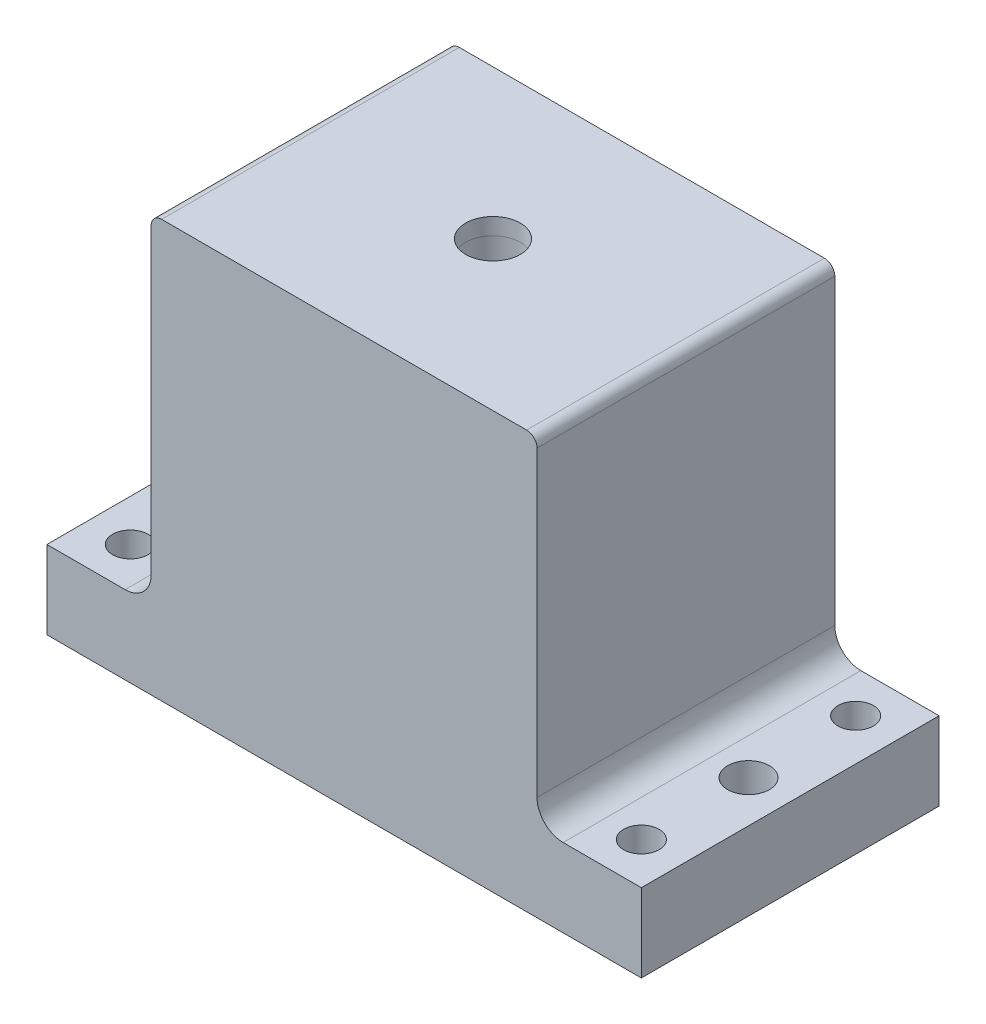
ISO-10303-21;
HEADER;
FILE_DESCRIPTION(('STEP AP214'),'2;1');
FILE_NAME('part.step','',(''),(''),'','','');
FILE_SCHEMA(('AUTOMOTIVE_DESIGN { 1 0 10303 214 1 1 1 1 }'));
ENDSEC;
DATA;
#1=APPLICATION_CONTEXT('core data for automotive mechanical design processes');
#2=APPLICATION_PROTOCOL_DEFINITION('international standard','automotive_design',2000,#1);
#3=PRODUCT_CONTEXT('',#1,'mechanical');
#4=PRODUCT('Part','Part','',(#3));
#5=PRODUCT_RELATED_PRODUCT_CATEGORY('part','',(#4));
#6=PRODUCT_DEFINITION_FORMATION('','',#4);
#7=PRODUCT_DEFINITION_CONTEXT('part definition',#1,'design');
#8=PRODUCT_DEFINITION('design','',#6,#7);
#9=PRODUCT_DEFINITION_SHAPE('','',#8);
#10=(LENGTH_UNIT() NAMED_UNIT(*) SI_UNIT(.MILLI.,.METRE.));
#11=(NAMED_UNIT(*) PLANE_ANGLE_UNIT() SI_UNIT($,.RADIAN.));
#12=(NAMED_UNIT(*) SI_UNIT($,.STERADIAN.) SOLID_ANGLE_UNIT());
#13=UNCERTAINTY_MEASURE_WITH_UNIT(LENGTH_MEASURE(1.E-05),#10,'distance_accuracy_value','');
#14=(GEOMETRIC_REPRESENTATION_CONTEXT(3) GLOBAL_UNCERTAINTY_ASSIGNED_CONTEXT((#13)) GLOBAL_UNIT_ASSIGNED_CONTEXT((#10,
#11,#12)) REPRESENTATION_CONTEXT('',''));
#15=CARTESIAN_POINT('',(0.,0.,0.));
#16=DIRECTION('',(0.,0.,1.));
#17=DIRECTION('',(1.,0.,0.));
#18=AXIS2_PLACEMENT_3D('',#15,#16,#17);
#19=CARTESIAN_POINT('',(37.,80.,28.55));
#20=DIRECTION('',(-1.,0.,0.));
#21=DIRECTION('',(0.,0.,1.));
#22=AXIS2_PLACEMENT_3D('',#19,#20,#21);
#23=PLANE('',#22);
#24=DIRECTION('',(0.,-1.,0.));
#25=VECTOR('',#24,1.);
#26=CARTESIAN_POINT('',(37.,80.,28.55));
#27=LINE('',#26,#25);
#28=CARTESIAN_POINT('',(37.,78.,28.55));
#29=VERTEX_POINT('',#28);
#30=CARTESIAN_POINT('',(37.,20.,28.55));
#31=VERTEX_POINT('',#30);
#32=EDGE_CURVE('E202',#29,#31,#27,.T.);
#33=ORIENTED_EDGE('',*,*,#32,.T.);
#34=DIRECTION('',(0.,0.,1.));
#35=VECTOR('',#34,1.);
#36=CARTESIAN_POINT('',(37.,20.,-28.55));
#37=LINE('',#36,#35);
#38=CARTESIAN_POINT('',(37.,20.,-28.55));
#39=VERTEX_POINT('',#38);
#40=EDGE_CURVE('E73',#31,#39,#37,.F.);
#41=ORIENTED_EDGE('',*,*,#40,.T.);
#42=DIRECTION('',(0.,-1.,0.));
#43=VECTOR('',#42,1.);
#44=CARTESIAN_POINT('',(37.,80.,-28.55));
#45=LINE('',#44,#43);
#46=CARTESIAN_POINT('',(37.,78.,-28.55));
#47=VERTEX_POINT('',#46);
#48=EDGE_CURVE('E212',#47,#39,#45,.T.);
#49=ORIENTED_EDGE('',*,*,#48,.F.);
#50=DIRECTION('',(0.,0.,-1.));
#51=VECTOR('',#50,1.);
#52=CARTESIAN_POINT('',(37.,78.,28.55));
#53=LINE('',#52,#51);
#54=EDGE_CURVE('E230',#47,#29,#53,.F.);
#55=ORIENTED_EDGE('',*,*,#54,.T.);
#56=EDGE_LOOP('',(#33,#41,#49,#55));
#57=FACE_BOUND('',#56,.T.);
#58=ADVANCED_FACE('F50',(#57),#23,.F.);
#59=CARTESIAN_POINT('',(-37.,80.,28.55));
#60=DIRECTION('',(1.,0.,0.));
#61=DIRECTION('',(0.,0.,-1.));
#62=AXIS2_PLACEMENT_3D('',#59,#60,#61);
#63=PLANE('',#62);
#64=DIRECTION('',(0.,-1.,0.));
#65=VECTOR('',#64,1.);
#66=CARTESIAN_POINT('',(-37.,80.,-28.55));
#67=LINE('',#66,#65);
#68=CARTESIAN_POINT('',(-37.,78.,-28.55));
#69=VERTEX_POINT('',#68);
#70=CARTESIAN_POINT('',(-37.,20.,-28.55));
#71=VERTEX_POINT('',#70);
#72=EDGE_CURVE('E209',#69,#71,#67,.T.);
#73=ORIENTED_EDGE('',*,*,#72,.T.);
#74=DIRECTION('',(0.,0.,1.));
#75=VECTOR('',#74,1.);
#76=CARTESIAN_POINT('',(-37.,20.,28.55));
#77=LINE('',#76,#75);
#78=CARTESIAN_POINT('',(-37.,20.,28.55));
#79=VERTEX_POINT('',#78);
#80=EDGE_CURVE('E235',#71,#79,#77,.T.);
#81=ORIENTED_EDGE('',*,*,#80,.T.);
#82=DIRECTION('',(0.,-1.,0.));
#83=VECTOR('',#82,1.);
#84=CARTESIAN_POINT('',(-37.,80.,28.55));
#85=LINE('',#84,#83);
#86=CARTESIAN_POINT('',(-37.,78.,28.55));
#87=VERTEX_POINT('',#86);
#88=EDGE_CURVE('E206',#87,#79,#85,.T.);
#89=ORIENTED_EDGE('',*,*,#88,.F.);
#90=DIRECTION('',(0.,0.,1.));
#91=VECTOR('',#90,1.);
#92=CARTESIAN_POINT('',(-37.,78.,28.55));
#93=LINE('',#92,#91);
#94=EDGE_CURVE('E224',#87,#69,#93,.F.);
#95=ORIENTED_EDGE('',*,*,#94,.T.);
#96=EDGE_LOOP('',(#73,#81,#89,#95));
#97=FACE_BOUND('',#96,.T.);
#98=ADVANCED_FACE('F301',(#97),#63,.F.);
#99=CARTESIAN_POINT('',(0.,-0.001000000000001,0.));
#100=DIRECTION('',(0.,1.,0.));
#101=DIRECTION('',(0.,0.,1.));
#102=AXIS2_PLACEMENT_3D('',#99,#100,#101);
#103=CYLINDRICAL_SURFACE('',#102,5.23);
#104=CARTESIAN_POINT('',(0.,80.,0.));
#105=DIRECTION('',(0.,1.,0.));
#106=DIRECTION('',(0.,0.,1.));
#107=AXIS2_PLACEMENT_3D('',#104,#105,#106);
#108=CIRCLE('',#107,5.23);
#109=CARTESIAN_POINT('',(0.,80.,5.23));
#110=VERTEX_POINT('',#109);
#111=EDGE_CURVE('E191',#110,#110,#108,.T.);
#112=ORIENTED_EDGE('',*,*,#111,.T.);
#113=EDGE_LOOP('',(#112));
#114=FACE_BOUND('',#113,.T.);
#115=CARTESIAN_POINT('',(0.,76.8,0.));
#116=DIRECTION('',(0.,-1.,0.));
#117=DIRECTION('',(0.,0.,1.));
#118=AXIS2_PLACEMENT_3D('',#115,#116,#117);
#119=CIRCLE('',#118,5.23);
#120=CARTESIAN_POINT('',(0.,76.8,5.23));
#121=VERTEX_POINT('',#120);
#122=EDGE_CURVE('E232',#121,#121,#119,.T.);
#123=ORIENTED_EDGE('',*,*,#122,.T.);
#124=EDGE_LOOP('',(#123));
#125=FACE_BOUND('',#124,.T.);
#126=ADVANCED_FACE('F307',(#114,#125),#103,.F.);
#127=CARTESIAN_POINT('',(-37.,80.,-28.55));
#128=DIRECTION('',(0.,0.,1.));
#129=DIRECTION('',(1.,0.,0.));
#130=AXIS2_PLACEMENT_3D('',#127,#128,#129);
#131=PLANE('',#130);
#132=ORIENTED_EDGE('',*,*,#72,.F.);
#133=CARTESIAN_POINT('',(-35.,78.,-28.55));
#134=DIRECTION('',(0.,0.,1.));
#135=DIRECTION('',(1.,0.,0.));
#136=AXIS2_PLACEMENT_3D('',#133,#134,#135);
#137=CIRCLE('',#136,2.);
#138=CARTESIAN_POINT('',(-35.,80.,-28.55));
#139=VERTEX_POINT('',#138);
#140=EDGE_CURVE('E228',#69,#139,#137,.F.);
#141=ORIENTED_EDGE('',*,*,#140,.T.);
#142=DIRECTION('',(-1.,0.,0.));
#143=VECTOR('',#142,1.);
#144=CARTESIAN_POINT('',(-37.,80.,-28.55));
#145=LINE('',#144,#143);
#146=CARTESIAN_POINT('',(35.,80.,-28.55));
#147=VERTEX_POINT('',#146);
#148=EDGE_CURVE('E195',#147,#139,#145,.T.);
#149=ORIENTED_EDGE('',*,*,#148,.F.);
#150=CARTESIAN_POINT('',(35.,78.,-28.55));
#151=DIRECTION('',(0.,0.,1.));
#152=DIRECTION('',(1.,0.,0.));
#153=AXIS2_PLACEMENT_3D('',#150,#151,#152);
#154=CIRCLE('',#153,2.);
#155=EDGE_CURVE('E226',#147,#47,#154,.F.);
#156=ORIENTED_EDGE('',*,*,#155,.T.);
#157=ORIENTED_EDGE('',*,*,#48,.T.);
#158=CARTESIAN_POINT('',(42.,20.,-28.55));
#159=DIRECTION('',(0.,0.,1.));
#160=DIRECTION('',(1.,0.,0.));
#161=AXIS2_PLACEMENT_3D('',#158,#159,#160);
#162=CIRCLE('',#161,5.);
#163=CARTESIAN_POINT('',(42.,15.,-28.55));
#164=VERTEX_POINT('',#163);
#165=EDGE_CURVE('E12',#39,#164,#162,.T.);
#166=ORIENTED_EDGE('',*,*,#165,.T.);
#167=DIRECTION('',(-1.,0.,0.));
#168=VECTOR('',#167,1.);
#169=CARTESIAN_POINT('',(37.,15.,-28.55));
#170=LINE('',#169,#168);
#171=CARTESIAN_POINT('',(57.,15.,-28.55));
#172=VERTEX_POINT('',#171);
#173=EDGE_CURVE('E146',#172,#164,#170,.T.);
#174=ORIENTED_EDGE('',*,*,#173,.F.);
#175=DIRECTION('',(0.,-1.,0.));
#176=VECTOR('',#175,1.);
#177=CARTESIAN_POINT('',(57.,15.,-28.55));
#178=LINE('',#177,#176);
#179=CARTESIAN_POINT('',(57.,0.,-28.55));
#180=VERTEX_POINT('',#179);
#181=EDGE_CURVE('E155',#172,#180,#178,.T.);
#182=ORIENTED_EDGE('',*,*,#181,.T.);
#183=DIRECTION('',(-1.,0.,0.));
#184=VECTOR('',#183,1.);
#185=CARTESIAN_POINT('',(-37.,0.,-28.55));
#186=LINE('',#185,#184);
#187=CARTESIAN_POINT('',(-57.,0.,-28.55));
#188=VERTEX_POINT('',#187);
#189=EDGE_CURVE('E194',#180,#188,#186,.T.);
#190=ORIENTED_EDGE('',*,*,#189,.T.);
#191=DIRECTION('',(0.,-1.,0.));
#192=VECTOR('',#191,1.);
#193=CARTESIAN_POINT('',(-57.,15.,-28.55));
#194=LINE('',#193,#192);
#195=CARTESIAN_POINT('',(-57.,15.,-28.55));
#196=VERTEX_POINT('',#195);
#197=EDGE_CURVE('E185',#196,#188,#194,.T.);
#198=ORIENTED_EDGE('',*,*,#197,.F.);
#199=DIRECTION('',(1.,0.,0.));
#200=VECTOR('',#199,1.);
#201=CARTESIAN_POINT('',(-37.,15.,-28.55));
#202=LINE('',#201,#200);
#203=CARTESIAN_POINT('',(-42.,15.,-28.55));
#204=VERTEX_POINT('',#203);
#205=EDGE_CURVE('E179',#196,#204,#202,.T.);
#206=ORIENTED_EDGE('',*,*,#205,.T.);
#207=CARTESIAN_POINT('',(-42.,20.,-28.55));
#208=DIRECTION('',(0.,0.,1.));
#209=DIRECTION('',(1.,0.,0.));
#210=AXIS2_PLACEMENT_3D('',#207,#208,#209);
#211=CIRCLE('',#210,5.);
#212=EDGE_CURVE('E252',#204,#71,#211,.T.);
#213=ORIENTED_EDGE('',*,*,#212,.T.);
#214=EDGE_LOOP('',(#132,#141,#149,#156,#157,#166,#174,#182,#190,#198,#206,#213));
#215=FACE_BOUND('',#214,.T.);
#216=ADVANCED_FACE('F163',(#215),#131,.F.);
#217=CARTESIAN_POINT('',(-37.,80.,28.55));
#218=DIRECTION('',(0.,0.,-1.));
#219=DIRECTION('',(-1.,0.,0.));
#220=AXIS2_PLACEMENT_3D('',#217,#218,#219);
#221=PLANE('',#220);
#222=DIRECTION('',(1.,0.,0.));
#223=VECTOR('',#222,1.);
#224=CARTESIAN_POINT('',(-37.,80.,28.55));
#225=LINE('',#224,#223);
#226=CARTESIAN_POINT('',(-35.,80.,28.55));
#227=VERTEX_POINT('',#226);
#228=CARTESIAN_POINT('',(35.,80.,28.55));
#229=VERTEX_POINT('',#228);
#230=EDGE_CURVE('E198',#227,#229,#225,.T.);
#231=ORIENTED_EDGE('',*,*,#230,.F.);
#232=CARTESIAN_POINT('',(-35.,78.,28.55));
#233=DIRECTION('',(0.,0.,-1.));
#234=DIRECTION('',(-1.,0.,0.));
#235=AXIS2_PLACEMENT_3D('',#232,#233,#234);
#236=CIRCLE('',#235,2.);
#237=EDGE_CURVE('E222',#227,#87,#236,.F.);
#238=ORIENTED_EDGE('',*,*,#237,.T.);
#239=ORIENTED_EDGE('',*,*,#88,.T.);
#240=CARTESIAN_POINT('',(-42.,20.,28.55));
#241=DIRECTION('',(0.,0.,-1.));
#242=DIRECTION('',(-1.,0.,0.));
#243=AXIS2_PLACEMENT_3D('',#240,#241,#242);
#244=CIRCLE('',#243,5.);
#245=CARTESIAN_POINT('',(-42.,15.,28.55));
#246=VERTEX_POINT('',#245);
#247=EDGE_CURVE('E250',#79,#246,#244,.T.);
#248=ORIENTED_EDGE('',*,*,#247,.T.);
#249=DIRECTION('',(-1.,0.,0.));
#250=VECTOR('',#249,1.);
#251=CARTESIAN_POINT('',(-37.,15.,28.55));
#252=LINE('',#251,#250);
#253=CARTESIAN_POINT('',(-57.,15.,28.55));
#254=VERTEX_POINT('',#253);
#255=EDGE_CURVE('E174',#246,#254,#252,.T.);
#256=ORIENTED_EDGE('',*,*,#255,.T.);
#257=DIRECTION('',(0.,-1.,0.));
#258=VECTOR('',#257,1.);
#259=CARTESIAN_POINT('',(-57.,15.,28.55));
#260=LINE('',#259,#258);
#261=CARTESIAN_POINT('',(-57.,0.,28.55));
#262=VERTEX_POINT('',#261);
#263=EDGE_CURVE('E182',#254,#262,#260,.T.);
#264=ORIENTED_EDGE('',*,*,#263,.T.);
#265=DIRECTION('',(1.,0.,0.));
#266=VECTOR('',#265,1.);
#267=CARTESIAN_POINT('',(-37.,0.,28.55));
#268=LINE('',#267,#266);
#269=CARTESIAN_POINT('',(57.,0.,28.55));
#270=VERTEX_POINT('',#269);
#271=EDGE_CURVE('E199',#262,#270,#268,.T.);
#272=ORIENTED_EDGE('',*,*,#271,.T.);
#273=DIRECTION('',(0.,-1.,0.));
#274=VECTOR('',#273,1.);
#275=CARTESIAN_POINT('',(57.,15.,28.55));
#276=LINE('',#275,#274);
#277=CARTESIAN_POINT('',(57.,15.,28.55));
#278=VERTEX_POINT('',#277);
#279=EDGE_CURVE('E160',#278,#270,#276,.T.);
#280=ORIENTED_EDGE('',*,*,#279,.F.);
#281=DIRECTION('',(1.,0.,0.));
#282=VECTOR('',#281,1.);
#283=CARTESIAN_POINT('',(37.,15.,28.55));
#284=LINE('',#283,#282);
#285=CARTESIAN_POINT('',(42.,15.,28.55));
#286=VERTEX_POINT('',#285);
#287=EDGE_CURVE('E148',#286,#278,#284,.T.);
#288=ORIENTED_EDGE('',*,*,#287,.F.);
#289=CARTESIAN_POINT('',(42.,20.,28.55));
#290=DIRECTION('',(0.,0.,-1.));
#291=DIRECTION('',(-1.,0.,0.));
#292=AXIS2_PLACEMENT_3D('',#289,#290,#291);
#293=CIRCLE('',#292,5.);
#294=EDGE_CURVE('E59',#286,#31,#293,.T.);
#295=ORIENTED_EDGE('',*,*,#294,.T.);
#296=ORIENTED_EDGE('',*,*,#32,.F.);
#297=CARTESIAN_POINT('',(35.,78.,28.55));
#298=DIRECTION('',(0.,0.,-1.));
#299=DIRECTION('',(-1.,0.,0.));
#300=AXIS2_PLACEMENT_3D('',#297,#298,#299);
#301=CIRCLE('',#300,2.);
#302=EDGE_CURVE('E220',#29,#229,#301,.F.);
#303=ORIENTED_EDGE('',*,*,#302,.T.);
#304=EDGE_LOOP('',(#231,#238,#239,#248,#256,#264,#272,#280,#288,#295,#296,#303));
#305=FACE_BOUND('',#304,.T.);
#306=ADVANCED_FACE('F353',(#305),#221,.F.);
#307=CARTESIAN_POINT('',(0.,80.,0.));
#308=DIRECTION('',(0.,-1.,0.));
#309=DIRECTION('',(0.,0.,-1.));
#310=AXIS2_PLACEMENT_3D('',#307,#308,#309);
#311=PLANE('',#310);
#312=ORIENTED_EDGE('',*,*,#111,.F.);
#313=EDGE_LOOP('',(#312));
#314=FACE_BOUND('',#313,.T.);
#315=ORIENTED_EDGE('',*,*,#148,.T.);
#316=DIRECTION('',(0.,0.,1.));
#317=VECTOR('',#316,1.);
#318=CARTESIAN_POINT('',(-35.,80.,0.));
#319=LINE('',#318,#317);
#320=EDGE_CURVE('E217',#139,#227,#319,.T.);
#321=ORIENTED_EDGE('',*,*,#320,.T.);
#322=ORIENTED_EDGE('',*,*,#230,.T.);
#323=DIRECTION('',(0.,0.,-1.));
#324=VECTOR('',#323,1.);
#325=CARTESIAN_POINT('',(35.,80.,0.));
#326=LINE('',#325,#324);
#327=EDGE_CURVE('E214',#229,#147,#326,.T.);
#328=ORIENTED_EDGE('',*,*,#327,.T.);
#329=EDGE_LOOP('',(#315,#321,#322,#328));
#330=FACE_BOUND('',#329,.T.);
#331=ADVANCED_FACE('F348',(#314,#330),#311,.F.);
#332=CARTESIAN_POINT('',(0.,0.,0.));
#333=DIRECTION('',(0.,-1.,0.));
#334=DIRECTION('',(0.,0.,-1.));
#335=AXIS2_PLACEMENT_3D('',#332,#333,#334);
#336=PLANE('',#335);
#337=CARTESIAN_POINT('',(49.,0.,0.));
#338=DIRECTION('',(0.,-1.,0.));
#339=DIRECTION('',(0.,0.,-1.));
#340=AXIS2_PLACEMENT_3D('',#337,#338,#339);
#341=CIRCLE('',#340,4.);
#342=CARTESIAN_POINT('',(49.,0.,-4.));
#343=VERTEX_POINT('',#342);
#344=EDGE_CURVE('E268',#343,#343,#341,.T.);
#345=ORIENTED_EDGE('',*,*,#344,.F.);
#346=EDGE_LOOP('',(#345));
#347=FACE_BOUND('',#346,.T.);
#348=CARTESIAN_POINT('',(-49.,0.,0.));
#349=DIRECTION('',(0.,-1.,0.));
#350=DIRECTION('',(0.,0.,-1.));
#351=AXIS2_PLACEMENT_3D('',#348,#349,#350);
#352=CIRCLE('',#351,4.);
#353=CARTESIAN_POINT('',(-49.,0.,-4.));
#354=VERTEX_POINT('',#353);
#355=EDGE_CURVE('E257',#354,#354,#352,.T.);
#356=ORIENTED_EDGE('',*,*,#355,.F.);
#357=EDGE_LOOP('',(#356));
#358=FACE_BOUND('',#357,.T.);
#359=CARTESIAN_POINT('',(49.,0.,-20.55));
#360=DIRECTION('',(0.,-1.,0.));
#361=DIRECTION('',(0.,0.,-1.));
#362=AXIS2_PLACEMENT_3D('',#359,#360,#361);
#363=CIRCLE('',#362,3.39999999999999);
#364=CARTESIAN_POINT('',(49.,0.,-23.95));
#365=VERTEX_POINT('',#364);
#366=EDGE_CURVE('E256',#365,#365,#363,.T.);
#367=ORIENTED_EDGE('',*,*,#366,.F.);
#368=EDGE_LOOP('',(#367));
#369=FACE_BOUND('',#368,.T.);
#370=CARTESIAN_POINT('',(-49.,0.,-20.55));
#371=DIRECTION('',(0.,-1.,0.));
#372=DIRECTION('',(0.,0.,-1.));
#373=AXIS2_PLACEMENT_3D('',#370,#371,#372);
#374=CIRCLE('',#373,3.39999999999999);
#375=CARTESIAN_POINT('',(-49.,0.,-23.95));
#376=VERTEX_POINT('',#375);
#377=EDGE_CURVE('E242',#376,#376,#374,.T.);
#378=ORIENTED_EDGE('',*,*,#377,.F.);
#379=EDGE_LOOP('',(#378));
#380=FACE_BOUND('',#379,.T.);
#381=CARTESIAN_POINT('',(-49.,0.,20.55));
#382=DIRECTION('',(0.,-1.,0.));
#383=DIRECTION('',(0.,0.,-1.));
#384=AXIS2_PLACEMENT_3D('',#381,#382,#383);
#385=CIRCLE('',#384,3.39999999999999);
#386=CARTESIAN_POINT('',(-49.,0.,17.15));
#387=VERTEX_POINT('',#386);
#388=EDGE_CURVE('E241',#387,#387,#385,.T.);
#389=ORIENTED_EDGE('',*,*,#388,.F.);
#390=EDGE_LOOP('',(#389));
#391=FACE_BOUND('',#390,.T.);
#392=CARTESIAN_POINT('',(49.,0.,20.55));
#393=DIRECTION('',(0.,-1.,0.));
#394=DIRECTION('',(0.,0.,-1.));
#395=AXIS2_PLACEMENT_3D('',#392,#393,#394);
#396=CIRCLE('',#395,3.39999999999999);
#397=CARTESIAN_POINT('',(49.,0.,17.15));
#398=VERTEX_POINT('',#397);
#399=EDGE_CURVE('E279',#398,#398,#396,.T.);
#400=ORIENTED_EDGE('',*,*,#399,.F.);
#401=EDGE_LOOP('',(#400));
#402=FACE_BOUND('',#401,.T.);
#403=CARTESIAN_POINT('',(0.,0.,0.));
#404=DIRECTION('',(0.,-1.,0.));
#405=DIRECTION('',(0.,0.,-1.));
#406=AXIS2_PLACEMENT_3D('',#403,#404,#405);
#407=CIRCLE('',#406,6.57054898648711);
#408=CARTESIAN_POINT('',(0.,0.,-6.57054898648711));
#409=VERTEX_POINT('',#408);
#410=EDGE_CURVE('E188',#409,#409,#407,.F.);
#411=ORIENTED_EDGE('',*,*,#410,.T.);
#412=EDGE_LOOP('',(#411));
#413=FACE_BOUND('',#412,.T.);
#414=ORIENTED_EDGE('',*,*,#189,.F.);
#415=DIRECTION('',(0.,0.,-1.));
#416=VECTOR('',#415,1.);
#417=CARTESIAN_POINT('',(57.,0.,-28.55));
#418=LINE('',#417,#416);
#419=EDGE_CURVE('E158',#270,#180,#418,.T.);
#420=ORIENTED_EDGE('',*,*,#419,.F.);
#421=ORIENTED_EDGE('',*,*,#271,.F.);
#422=DIRECTION('',(0.,0.,-1.));
#423=VECTOR('',#422,1.);
#424=CARTESIAN_POINT('',(-57.,0.,-28.55));
#425=LINE('',#424,#423);
#426=EDGE_CURVE('E172',#262,#188,#425,.T.);
#427=ORIENTED_EDGE('',*,*,#426,.T.);
#428=EDGE_LOOP('',(#414,#420,#421,#427));
#429=FACE_BOUND('',#428,.T.);
#430=ADVANCED_FACE('F316',(#347,#358,#369,#380,#391,#402,#413,#429),#336,.T.);
#431=CARTESIAN_POINT('',(-35.,78.,0.));
#432=DIRECTION('',(0.,0.,1.));
#433=DIRECTION('',(1.,0.,0.));
#434=AXIS2_PLACEMENT_3D('',#431,#432,#433);
#435=CYLINDRICAL_SURFACE('',#434,2.);
#436=ORIENTED_EDGE('',*,*,#140,.F.);
#437=ORIENTED_EDGE('',*,*,#94,.F.);
#438=ORIENTED_EDGE('',*,*,#237,.F.);
#439=ORIENTED_EDGE('',*,*,#320,.F.);
#440=EDGE_LOOP('',(#436,#437,#438,#439));
#441=FACE_BOUND('',#440,.T.);
#442=ADVANCED_FACE('F312',(#441),#435,.T.);
#443=CARTESIAN_POINT('',(35.,78.,0.));
#444=DIRECTION('',(0.,0.,-1.));
#445=DIRECTION('',(-1.,0.,0.));
#446=AXIS2_PLACEMENT_3D('',#443,#444,#445);
#447=CYLINDRICAL_SURFACE('',#446,2.);
#448=ORIENTED_EDGE('',*,*,#302,.F.);
#449=ORIENTED_EDGE('',*,*,#54,.F.);
#450=ORIENTED_EDGE('',*,*,#155,.F.);
#451=ORIENTED_EDGE('',*,*,#327,.F.);
#452=EDGE_LOOP('',(#448,#449,#450,#451));
#453=FACE_BOUND('',#452,.T.);
#454=ADVANCED_FACE('F315',(#453),#447,.T.);
#455=CARTESIAN_POINT('',(0.,76.8,0.));
#456=DIRECTION('',(0.,-1.,0.));
#457=DIRECTION('',(0.,0.,-1.));
#458=AXIS2_PLACEMENT_3D('',#455,#456,#457);
#459=CONICAL_SURFACE('',#458,5.23,0.0174532925199433);
#460=ORIENTED_EDGE('',*,*,#122,.F.);
#461=EDGE_LOOP('',(#460));
#462=FACE_BOUND('',#461,.T.);
#463=ORIENTED_EDGE('',*,*,#410,.F.);
#464=EDGE_LOOP('',(#463));
#465=FACE_BOUND('',#464,.T.);
#466=ADVANCED_FACE('F320',(#462,#465),#459,.F.);
#467=CARTESIAN_POINT('',(-57.,15.,-28.55));
#468=DIRECTION('',(-1.,0.,0.));
#469=DIRECTION('',(0.,0.,1.));
#470=AXIS2_PLACEMENT_3D('',#467,#468,#469);
#471=PLANE('',#470);
#472=ORIENTED_EDGE('',*,*,#426,.F.);
#473=ORIENTED_EDGE('',*,*,#263,.F.);
#474=DIRECTION('',(0.,0.,-1.));
#475=VECTOR('',#474,1.);
#476=CARTESIAN_POINT('',(-57.,15.,-28.55));
#477=LINE('',#476,#475);
#478=EDGE_CURVE('E176',#254,#196,#477,.T.);
#479=ORIENTED_EDGE('',*,*,#478,.T.);
#480=ORIENTED_EDGE('',*,*,#197,.T.);
#481=EDGE_LOOP('',(#472,#473,#479,#480));
#482=FACE_BOUND('',#481,.T.);
#483=ADVANCED_FACE('F323',(#482),#471,.T.);
#484=CARTESIAN_POINT('',(0.,15.,0.));
#485=DIRECTION('',(0.,-1.,0.));
#486=DIRECTION('',(0.,0.,-1.));
#487=AXIS2_PLACEMENT_3D('',#484,#485,#486);
#488=PLANE('',#487);
#489=CARTESIAN_POINT('',(-49.,15.,0.));
#490=DIRECTION('',(0.,-1.,0.));
#491=DIRECTION('',(0.,0.,-1.));
#492=AXIS2_PLACEMENT_3D('',#489,#490,#491);
#493=CIRCLE('',#492,3.99999999999999);
#494=CARTESIAN_POINT('',(-49.,15.,-3.99999999999999));
#495=VERTEX_POINT('',#494);
#496=EDGE_CURVE('E254',#495,#495,#493,.T.);
#497=ORIENTED_EDGE('',*,*,#496,.T.);
#498=EDGE_LOOP('',(#497));
#499=FACE_BOUND('',#498,.T.);
#500=CARTESIAN_POINT('',(-49.,15.,-20.55));
#501=DIRECTION('',(0.,-1.,0.));
#502=DIRECTION('',(0.,0.,-1.));
#503=AXIS2_PLACEMENT_3D('',#500,#501,#502);
#504=CIRCLE('',#503,3.39999999999999);
#505=CARTESIAN_POINT('',(-49.,15.,-23.95));
#506=VERTEX_POINT('',#505);
#507=EDGE_CURVE('E238',#506,#506,#504,.T.);
#508=ORIENTED_EDGE('',*,*,#507,.T.);
#509=EDGE_LOOP('',(#508));
#510=FACE_BOUND('',#509,.T.);
#511=CARTESIAN_POINT('',(-49.,15.,20.55));
#512=DIRECTION('',(0.,-1.,0.));
#513=DIRECTION('',(0.,0.,-1.));
#514=AXIS2_PLACEMENT_3D('',#511,#512,#513);
#515=CIRCLE('',#514,3.39999999999999);
#516=CARTESIAN_POINT('',(-49.,15.,17.15));
#517=VERTEX_POINT('',#516);
#518=EDGE_CURVE('E277',#517,#517,#515,.T.);
#519=ORIENTED_EDGE('',*,*,#518,.T.);
#520=EDGE_LOOP('',(#519));
#521=FACE_BOUND('',#520,.T.);
#522=ORIENTED_EDGE('',*,*,#255,.F.);
#523=DIRECTION('',(0.,0.,1.));
#524=VECTOR('',#523,1.);
#525=CARTESIAN_POINT('',(-42.,15.,-28.55));
#526=LINE('',#525,#524);
#527=EDGE_CURVE('E245',#246,#204,#526,.F.);
#528=ORIENTED_EDGE('',*,*,#527,.T.);
#529=ORIENTED_EDGE('',*,*,#205,.F.);
#530=ORIENTED_EDGE('',*,*,#478,.F.);
#531=EDGE_LOOP('',(#522,#528,#529,#530));
#532=FACE_BOUND('',#531,.T.);
#533=ADVANCED_FACE('F358',(#499,#510,#521,#532),#488,.F.);
#534=CARTESIAN_POINT('',(57.,15.,-28.55));
#535=DIRECTION('',(-1.,0.,0.));
#536=DIRECTION('',(0.,0.,1.));
#537=AXIS2_PLACEMENT_3D('',#534,#535,#536);
#538=PLANE('',#537);
#539=ORIENTED_EDGE('',*,*,#419,.T.);
#540=ORIENTED_EDGE('',*,*,#181,.F.);
#541=DIRECTION('',(0.,0.,-1.));
#542=VECTOR('',#541,1.);
#543=CARTESIAN_POINT('',(57.,15.,-28.55));
#544=LINE('',#543,#542);
#545=EDGE_CURVE('E141',#278,#172,#544,.T.);
#546=ORIENTED_EDGE('',*,*,#545,.F.);
#547=ORIENTED_EDGE('',*,*,#279,.T.);
#548=EDGE_LOOP('',(#539,#540,#546,#547));
#549=FACE_BOUND('',#548,.T.);
#550=ADVANCED_FACE('F156',(#549),#538,.F.);
#551=CARTESIAN_POINT('',(0.,15.,0.));
#552=DIRECTION('',(0.,-1.,0.));
#553=DIRECTION('',(0.,0.,-1.));
#554=AXIS2_PLACEMENT_3D('',#551,#552,#553);
#555=PLANE('',#554);
#556=CARTESIAN_POINT('',(49.,15.,0.));
#557=DIRECTION('',(0.,-1.,0.));
#558=DIRECTION('',(0.,0.,-1.));
#559=AXIS2_PLACEMENT_3D('',#556,#557,#558);
#560=CIRCLE('',#559,3.99999999999999);
#561=CARTESIAN_POINT('',(49.,15.,-3.99999999999999));
#562=VERTEX_POINT('',#561);
#563=EDGE_CURVE('E54',#562,#562,#560,.T.);
#564=ORIENTED_EDGE('',*,*,#563,.T.);
#565=EDGE_LOOP('',(#564));
#566=FACE_BOUND('',#565,.T.);
#567=CARTESIAN_POINT('',(49.,15.,-20.55));
#568=DIRECTION('',(0.,-1.,0.));
#569=DIRECTION('',(0.,0.,-1.));
#570=AXIS2_PLACEMENT_3D('',#567,#568,#569);
#571=CIRCLE('',#570,3.39999999999999);
#572=CARTESIAN_POINT('',(49.,15.,-23.95));
#573=VERTEX_POINT('',#572);
#574=EDGE_CURVE('E261',#573,#573,#571,.T.);
#575=ORIENTED_EDGE('',*,*,#574,.T.);
#576=EDGE_LOOP('',(#575));
#577=FACE_BOUND('',#576,.T.);
#578=CARTESIAN_POINT('',(49.,15.,20.55));
#579=DIRECTION('',(0.,-1.,0.));
#580=DIRECTION('',(0.,0.,-1.));
#581=AXIS2_PLACEMENT_3D('',#578,#579,#580);
#582=CIRCLE('',#581,3.39999999999999);
#583=CARTESIAN_POINT('',(49.,15.,17.15));
#584=VERTEX_POINT('',#583);
#585=EDGE_CURVE('E166',#584,#584,#582,.T.);
#586=ORIENTED_EDGE('',*,*,#585,.T.);
#587=EDGE_LOOP('',(#586));
#588=FACE_BOUND('',#587,.T.);
#589=ORIENTED_EDGE('',*,*,#173,.T.);
#590=DIRECTION('',(0.,0.,1.));
#591=VECTOR('',#590,1.);
#592=CARTESIAN_POINT('',(42.,15.,28.55));
#593=LINE('',#592,#591);
#594=EDGE_CURVE('E247',#164,#286,#593,.T.);
#595=ORIENTED_EDGE('',*,*,#594,.T.);
#596=ORIENTED_EDGE('',*,*,#287,.T.);
#597=ORIENTED_EDGE('',*,*,#545,.T.);
#598=EDGE_LOOP('',(#589,#595,#596,#597));
#599=FACE_BOUND('',#598,.T.);
#600=ADVANCED_FACE('F143',(#566,#577,#588,#599),#555,.F.);
#601=CARTESIAN_POINT('',(49.,0.,20.55));
#602=DIRECTION('',(0.,-1.,0.));
#603=DIRECTION('',(0.,0.,-1.));
#604=AXIS2_PLACEMENT_3D('',#601,#602,#603);
#605=CYLINDRICAL_SURFACE('',#604,3.39999999999999);
#606=ORIENTED_EDGE('',*,*,#399,.T.);
#607=EDGE_LOOP('',(#606));
#608=FACE_BOUND('',#607,.T.);
#609=ORIENTED_EDGE('',*,*,#585,.F.);
#610=EDGE_LOOP('',(#609));
#611=FACE_BOUND('',#610,.T.);
#612=ADVANCED_FACE('F287',(#608,#611),#605,.F.);
#613=CARTESIAN_POINT('',(-49.,0.,20.55));
#614=DIRECTION('',(0.,-1.,0.));
#615=DIRECTION('',(0.,0.,-1.));
#616=AXIS2_PLACEMENT_3D('',#613,#614,#615);
#617=CYLINDRICAL_SURFACE('',#616,3.39999999999999);
#618=ORIENTED_EDGE('',*,*,#388,.T.);
#619=EDGE_LOOP('',(#618));
#620=FACE_BOUND('',#619,.T.);
#621=ORIENTED_EDGE('',*,*,#518,.F.);
#622=EDGE_LOOP('',(#621));
#623=FACE_BOUND('',#622,.T.);
#624=ADVANCED_FACE('F289',(#620,#623),#617,.F.);
#625=CARTESIAN_POINT('',(-49.,0.,-20.55));
#626=DIRECTION('',(0.,-1.,0.));
#627=DIRECTION('',(0.,0.,-1.));
#628=AXIS2_PLACEMENT_3D('',#625,#626,#627);
#629=CYLINDRICAL_SURFACE('',#628,3.39999999999999);
#630=ORIENTED_EDGE('',*,*,#377,.T.);
#631=EDGE_LOOP('',(#630));
#632=FACE_BOUND('',#631,.T.);
#633=ORIENTED_EDGE('',*,*,#507,.F.);
#634=EDGE_LOOP('',(#633));
#635=FACE_BOUND('',#634,.T.);
#636=ADVANCED_FACE('F294',(#632,#635),#629,.F.);
#637=CARTESIAN_POINT('',(49.,0.,-20.55));
#638=DIRECTION('',(0.,-1.,0.));
#639=DIRECTION('',(0.,0.,-1.));
#640=AXIS2_PLACEMENT_3D('',#637,#638,#639);
#641=CYLINDRICAL_SURFACE('',#640,3.39999999999999);
#642=ORIENTED_EDGE('',*,*,#366,.T.);
#643=EDGE_LOOP('',(#642));
#644=FACE_BOUND('',#643,.T.);
#645=ORIENTED_EDGE('',*,*,#574,.F.);
#646=EDGE_LOOP('',(#645));
#647=FACE_BOUND('',#646,.T.);
#648=ADVANCED_FACE('F327',(#644,#647),#641,.F.);
#649=CARTESIAN_POINT('',(-42.,20.,28.55));
#650=DIRECTION('',(0.,0.,-1.));
#651=DIRECTION('',(-1.,0.,0.));
#652=AXIS2_PLACEMENT_3D('',#649,#650,#651);
#653=CYLINDRICAL_SURFACE('',#652,5.);
#654=ORIENTED_EDGE('',*,*,#212,.F.);
#655=ORIENTED_EDGE('',*,*,#527,.F.);
#656=ORIENTED_EDGE('',*,*,#247,.F.);
#657=ORIENTED_EDGE('',*,*,#80,.F.);
#658=EDGE_LOOP('',(#654,#655,#656,#657));
#659=FACE_BOUND('',#658,.T.);
#660=ADVANCED_FACE('F325',(#659),#653,.F.);
#661=CARTESIAN_POINT('',(42.,20.,0.));
#662=DIRECTION('',(0.,0.,-1.));
#663=DIRECTION('',(-1.,0.,0.));
#664=AXIS2_PLACEMENT_3D('',#661,#662,#663);
#665=CYLINDRICAL_SURFACE('',#664,5.);
#666=ORIENTED_EDGE('',*,*,#165,.F.);
#667=ORIENTED_EDGE('',*,*,#40,.F.);
#668=ORIENTED_EDGE('',*,*,#294,.F.);
#669=ORIENTED_EDGE('',*,*,#594,.F.);
#670=EDGE_LOOP('',(#666,#667,#668,#669));
#671=FACE_BOUND('',#670,.T.);
#672=ADVANCED_FACE('F52',(#671),#665,.F.);
#673=CARTESIAN_POINT('',(-49.,0.,0.));
#674=DIRECTION('',(0.,-1.,0.));
#675=DIRECTION('',(0.,0.,-1.));
#676=AXIS2_PLACEMENT_3D('',#673,#674,#675);
#677=CYLINDRICAL_SURFACE('',#676,3.99999999999999);
#678=ORIENTED_EDGE('',*,*,#355,.T.);
#679=EDGE_LOOP('',(#678));
#680=FACE_BOUND('',#679,.T.);
#681=ORIENTED_EDGE('',*,*,#496,.F.);
#682=EDGE_LOOP('',(#681));
#683=FACE_BOUND('',#682,.T.);
#684=ADVANCED_FACE('F333',(#680,#683),#677,.F.);
#685=CARTESIAN_POINT('',(49.,0.,0.));
#686=DIRECTION('',(0.,-1.,0.));
#687=DIRECTION('',(0.,0.,-1.));
#688=AXIS2_PLACEMENT_3D('',#685,#686,#687);
#689=CYLINDRICAL_SURFACE('',#688,3.99999999999999);
#690=ORIENTED_EDGE('',*,*,#344,.T.);
#691=EDGE_LOOP('',(#690));
#692=FACE_BOUND('',#691,.T.);
#693=ORIENTED_EDGE('',*,*,#563,.F.);
#694=EDGE_LOOP('',(#693));
#695=FACE_BOUND('',#694,.T.);
#696=ADVANCED_FACE('F560',(#692,#695),#689,.F.);
#697=CLOSED_SHELL('',(#58,#98,#126,#216,#306,#331,#430,#442,#454,#466,#483,#533,#550,#600,#612,
#624,#636,#648,#660,#672,#684,#696));
#698=MANIFOLD_SOLID_BREP('B2',#697);
#699=ADVANCED_BREP_SHAPE_REPRESENTATION('',(#18,#698),#14);
#700=SHAPE_DEFINITION_REPRESENTATION(#9,#699);
ENDSEC;
END-ISO-10303-21;
